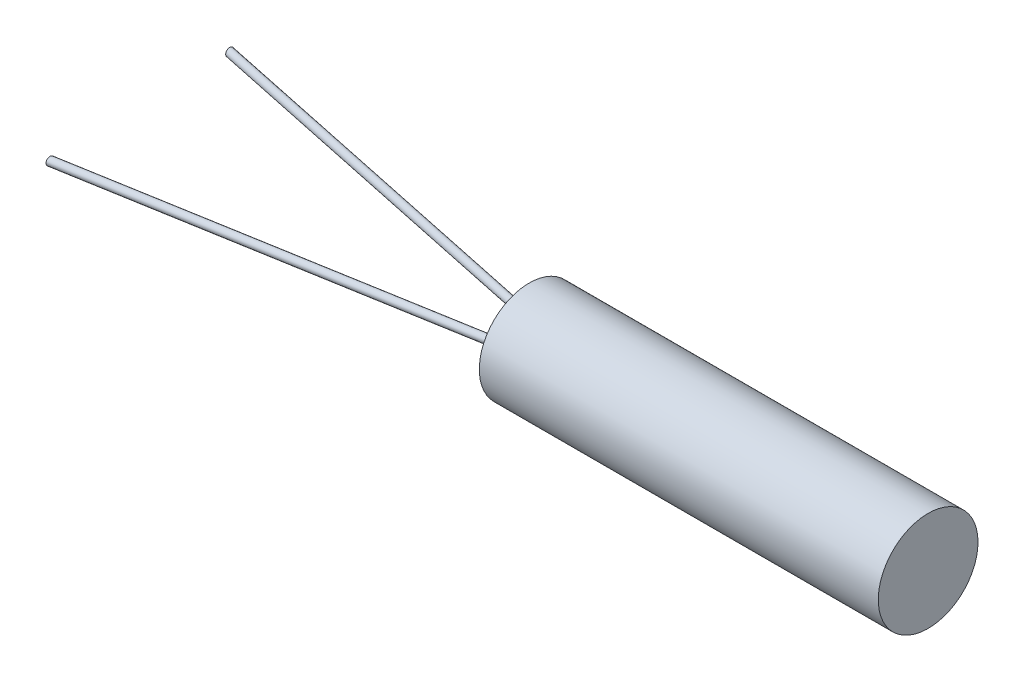
ISO-10303-21;
HEADER;
FILE_DESCRIPTION(('STEP AP214'),'2;1');
FILE_NAME('part.step','',(''),(''),'','','');
FILE_SCHEMA(('AUTOMOTIVE_DESIGN { 1 0 10303 214 1 1 1 1 }'));
ENDSEC;
DATA;
#1=APPLICATION_CONTEXT('core data for automotive mechanical design processes');
#2=APPLICATION_PROTOCOL_DEFINITION('international standard','automotive_design',2000,#1);
#3=PRODUCT_CONTEXT('',#1,'mechanical');
#4=PRODUCT('Part','Part','',(#3));
#5=PRODUCT_RELATED_PRODUCT_CATEGORY('part','',(#4));
#6=PRODUCT_DEFINITION_FORMATION('','',#4);
#7=PRODUCT_DEFINITION_CONTEXT('part definition',#1,'design');
#8=PRODUCT_DEFINITION('design','',#6,#7);
#9=PRODUCT_DEFINITION_SHAPE('','',#8);
#10=(LENGTH_UNIT() NAMED_UNIT(*) SI_UNIT(.MILLI.,.METRE.));
#11=(NAMED_UNIT(*) PLANE_ANGLE_UNIT() SI_UNIT($,.RADIAN.));
#12=(NAMED_UNIT(*) SI_UNIT($,.STERADIAN.) SOLID_ANGLE_UNIT());
#13=UNCERTAINTY_MEASURE_WITH_UNIT(LENGTH_MEASURE(1.E-05),#10,'distance_accuracy_value','');
#14=(GEOMETRIC_REPRESENTATION_CONTEXT(3) GLOBAL_UNCERTAINTY_ASSIGNED_CONTEXT((#13)) GLOBAL_UNIT_ASSIGNED_CONTEXT((#10,
#11,#12)) REPRESENTATION_CONTEXT('',''));
#15=CARTESIAN_POINT('',(0.,0.,0.));
#16=DIRECTION('',(0.,0.,1.));
#17=DIRECTION('',(1.,0.,0.));
#18=AXIS2_PLACEMENT_3D('',#15,#16,#17);
#19=CARTESIAN_POINT('',(25.4,0.,0.));
#20=DIRECTION('',(-1.,0.,0.));
#21=DIRECTION('',(0.,0.,1.));
#22=AXIS2_PLACEMENT_3D('',#19,#20,#21);
#23=CYLINDRICAL_SURFACE('',#22,3.175);
#24=CARTESIAN_POINT('',(25.4,0.,0.));
#25=DIRECTION('',(1.,0.,0.));
#26=DIRECTION('',(0.,0.,-1.));
#27=AXIS2_PLACEMENT_3D('',#24,#25,#26);
#28=CIRCLE('',#27,3.175);
#29=CARTESIAN_POINT('',(25.4,0.,-3.175));
#30=VERTEX_POINT('',#29);
#31=EDGE_CURVE('E48',#30,#30,#28,.T.);
#32=ORIENTED_EDGE('',*,*,#31,.F.);
#33=EDGE_LOOP('',(#32));
#34=FACE_BOUND('',#33,.T.);
#35=CARTESIAN_POINT('',(0.,0.,0.));
#36=DIRECTION('',(1.,0.,0.));
#37=DIRECTION('',(0.,0.,-1.));
#38=AXIS2_PLACEMENT_3D('',#35,#36,#37);
#39=CIRCLE('',#38,3.175);
#40=CARTESIAN_POINT('',(0.,0.,-3.175));
#41=VERTEX_POINT('',#40);
#42=EDGE_CURVE('E67',#41,#41,#39,.T.);
#43=ORIENTED_EDGE('',*,*,#42,.T.);
#44=EDGE_LOOP('',(#43));
#45=FACE_BOUND('',#44,.T.);
#46=ADVANCED_FACE('F41',(#34,#45),#23,.T.);
#47=CARTESIAN_POINT('',(25.4,0.,0.));
#48=DIRECTION('',(1.,0.,0.));
#49=DIRECTION('',(0.,0.,-1.));
#50=AXIS2_PLACEMENT_3D('',#47,#48,#49);
#51=PLANE('',#50);
#52=ORIENTED_EDGE('',*,*,#31,.T.);
#53=EDGE_LOOP('',(#52));
#54=FACE_BOUND('',#53,.T.);
#55=ADVANCED_FACE('F76',(#54),#51,.T.);
#56=CARTESIAN_POINT('',(0.,0.,0.));
#57=DIRECTION('',(1.,0.,0.));
#58=DIRECTION('',(0.,0.,-1.));
#59=AXIS2_PLACEMENT_3D('',#56,#57,#58);
#60=PLANE('',#59);
#61=CARTESIAN_POINT('',(0.,0.,1.016));
#62=DIRECTION('',(1.,0.,0.));
#63=DIRECTION('',(0.,1.,0.));
#64=AXIS2_PLACEMENT_3D('',#61,#62,#63);
#65=CIRCLE('',#64,0.254);
#66=CARTESIAN_POINT('',(0.,0.254,1.016));
#67=VERTEX_POINT('',#66);
#68=EDGE_CURVE('E11',#67,#67,#65,.F.);
#69=ORIENTED_EDGE('',*,*,#68,.F.);
#70=EDGE_LOOP('',(#69));
#71=FACE_BOUND('',#70,.T.);
#72=CARTESIAN_POINT('',(0.,0.,-1.016));
#73=DIRECTION('',(-1.,0.,0.));
#74=DIRECTION('',(0.,0.,1.));
#75=AXIS2_PLACEMENT_3D('',#72,#73,#74);
#76=CIRCLE('',#75,0.254);
#77=CARTESIAN_POINT('',(0.,0.,-0.762000000000001));
#78=VERTEX_POINT('',#77);
#79=EDGE_CURVE('E61',#78,#78,#76,.T.);
#80=ORIENTED_EDGE('',*,*,#79,.F.);
#81=EDGE_LOOP('',(#80));
#82=FACE_BOUND('',#81,.T.);
#83=ORIENTED_EDGE('',*,*,#42,.F.);
#84=EDGE_LOOP('',(#83));
#85=FACE_BOUND('',#84,.T.);
#86=ADVANCED_FACE('F73',(#71,#82,#85),#60,.F.);
#87=CARTESIAN_POINT('',(-25.4462446770276,0.,-6.37928698861856));
#88=DIRECTION('',(-1.,0.,0.));
#89=DIRECTION('',(0.,0.,1.));
#90=AXIS2_PLACEMENT_3D('',#87,#88,#89);
#91=PLANE('',#90);
#92=CARTESIAN_POINT('',(-25.4462446770276,0.,-6.37928698861856));
#93=DIRECTION('',(-1.,0.,0.));
#94=DIRECTION('',(0.,0.,1.));
#95=AXIS2_PLACEMENT_3D('',#92,#93,#94);
#96=CIRCLE('',#95,0.254);
#97=CARTESIAN_POINT('',(-25.4462446770276,0.,-6.12528698861856));
#98=VERTEX_POINT('',#97);
#99=EDGE_CURVE('E53',#98,#98,#96,.T.);
#100=ORIENTED_EDGE('',*,*,#99,.T.);
#101=EDGE_LOOP('',(#100));
#102=FACE_BOUND('',#101,.T.);
#103=ADVANCED_FACE('F75',(#102),#91,.T.);
#104=CARTESIAN_POINT('',(0.,0.,-0.762000000000001));
#105=CARTESIAN_POINT('',(-25.4462446770276,0.,-6.12528698861856));
#106=CARTESIAN_POINT('',(0.,0.508,-0.762000000000001));
#107=CARTESIAN_POINT('',(-25.4462446770276,0.508,-6.12528698861856));
#108=CARTESIAN_POINT('',(0.,0.508,-1.27));
#109=CARTESIAN_POINT('',(-25.4462446770276,0.508,-6.63328698861856));
#110=CARTESIAN_POINT('',(0.,0.,-1.27));
#111=CARTESIAN_POINT('',(-25.4462446770276,0.,-6.63328698861856));
#112=CARTESIAN_POINT('',(0.,-0.508,-1.27));
#113=CARTESIAN_POINT('',(-25.4462446770276,-0.508,-6.63328698861856));
#114=CARTESIAN_POINT('',(0.,-0.508,-0.762000000000001));
#115=CARTESIAN_POINT('',(-25.4462446770276,-0.508,-6.12528698861856));
#116=CARTESIAN_POINT('',(0.,0.,-0.762000000000001));
#117=CARTESIAN_POINT('',(-25.4462446770276,0.,-6.12528698861856));
#118=(BOUNDED_SURFACE() B_SPLINE_SURFACE(3,1,((#104,#105),(#106,#107),(#108,#109),(#110,#111),
(#112,#113),(#114,#115),(#116,#117)),.UNSPECIFIED.,.T.,.F.,.F.) B_SPLINE_SURFACE_WITH_KNOTS((4,
3,4),(2,2),(0.,0.5,1.),(0.,1.),
.UNSPECIFIED.) GEOMETRIC_REPRESENTATION_ITEM() RATIONAL_B_SPLINE_SURFACE(((1.,1.),
(0.333333333333333,0.333333333333333),(0.333333333333333,0.333333333333333),(1.,1.),
(0.333333333333333,0.333333333333333),(0.333333333333333,0.333333333333333),(1.,1.))) REPRESENTATION_ITEM('') SURFACE());
#119=ORIENTED_EDGE('',*,*,#99,.F.);
#120=EDGE_LOOP('',(#119));
#121=FACE_BOUND('',#120,.T.);
#122=ORIENTED_EDGE('',*,*,#79,.T.);
#123=EDGE_LOOP('',(#122));
#124=FACE_BOUND('',#123,.T.);
#125=ADVANCED_FACE('F78',(#121,#124),#118,.T.);
#126=CARTESIAN_POINT('',(-25.1585225296651,0.,5.35026987597575));
#127=DIRECTION('',(1.,0.,0.));
#128=DIRECTION('',(0.,0.,-1.));
#129=AXIS2_PLACEMENT_3D('',#126,#127,#128);
#130=PLANE('',#129);
#131=CARTESIAN_POINT('',(-25.1585225296651,0.,5.35026987597575));
#132=DIRECTION('',(1.,0.,0.));
#133=DIRECTION('',(0.,0.,-1.));
#134=AXIS2_PLACEMENT_3D('',#131,#132,#133);
#135=CIRCLE('',#134,0.254);
#136=CARTESIAN_POINT('',(-25.1585225296651,0.,5.09626987597576));
#137=VERTEX_POINT('',#136);
#138=EDGE_CURVE('E57',#137,#137,#135,.T.);
#139=ORIENTED_EDGE('',*,*,#138,.F.);
#140=EDGE_LOOP('',(#139));
#141=FACE_BOUND('',#140,.T.);
#142=ADVANCED_FACE('F89',(#141),#130,.F.);
#143=CARTESIAN_POINT('',(0.,0.,0.762));
#144=CARTESIAN_POINT('',(-25.1585225296651,0.,5.09626987597576));
#145=CARTESIAN_POINT('',(0.,0.508,0.762));
#146=CARTESIAN_POINT('',(-25.1585225296651,0.508000000000002,5.09626987597576));
#147=CARTESIAN_POINT('',(0.,0.508,1.27));
#148=CARTESIAN_POINT('',(-25.1585225296651,0.508000000000002,5.60426987597575));
#149=CARTESIAN_POINT('',(0.,0.,1.27));
#150=CARTESIAN_POINT('',(-25.1585225296651,0.,5.60426987597575));
#151=CARTESIAN_POINT('',(0.,-0.508,1.27));
#152=CARTESIAN_POINT('',(-25.1585225296651,-0.507999999999998,5.60426987597575));
#153=CARTESIAN_POINT('',(0.,-0.508,0.762));
#154=CARTESIAN_POINT('',(-25.1585225296651,-0.507999999999998,5.09626987597576));
#155=CARTESIAN_POINT('',(0.,0.,0.762));
#156=CARTESIAN_POINT('',(-25.1585225296651,0.,5.09626987597576));
#157=(BOUNDED_SURFACE() B_SPLINE_SURFACE(3,1,((#143,#144),(#145,#146),(#147,#148),(#149,#150),
(#151,#152),(#153,#154),(#155,#156)),.UNSPECIFIED.,.T.,.F.,.F.) B_SPLINE_SURFACE_WITH_KNOTS((4,
3,4),(2,2),(0.,0.5,1.),(0.,1.),
.UNSPECIFIED.) GEOMETRIC_REPRESENTATION_ITEM() RATIONAL_B_SPLINE_SURFACE(((1.,1.),
(0.333333333333333,0.333333333333333),(0.333333333333333,0.333333333333333),(1.,1.),
(0.333333333333333,0.333333333333333),(0.333333333333333,0.333333333333333),(1.,1.))) REPRESENTATION_ITEM('') SURFACE());
#158=ORIENTED_EDGE('',*,*,#138,.T.);
#159=EDGE_LOOP('',(#158));
#160=FACE_BOUND('',#159,.T.);
#161=ORIENTED_EDGE('',*,*,#68,.T.);
#162=EDGE_LOOP('',(#161));
#163=FACE_BOUND('',#162,.T.);
#164=ADVANCED_FACE('F58',(#160,#163),#157,.F.);
#165=CLOSED_SHELL('',(#46,#55,#86,#103,#125,#142,#164));
#166=MANIFOLD_SOLID_BREP('B2',#165);
#167=ADVANCED_BREP_SHAPE_REPRESENTATION('',(#18,#166),#14);
#168=SHAPE_DEFINITION_REPRESENTATION(#9,#167);
ENDSEC;
END-ISO-10303-21;
